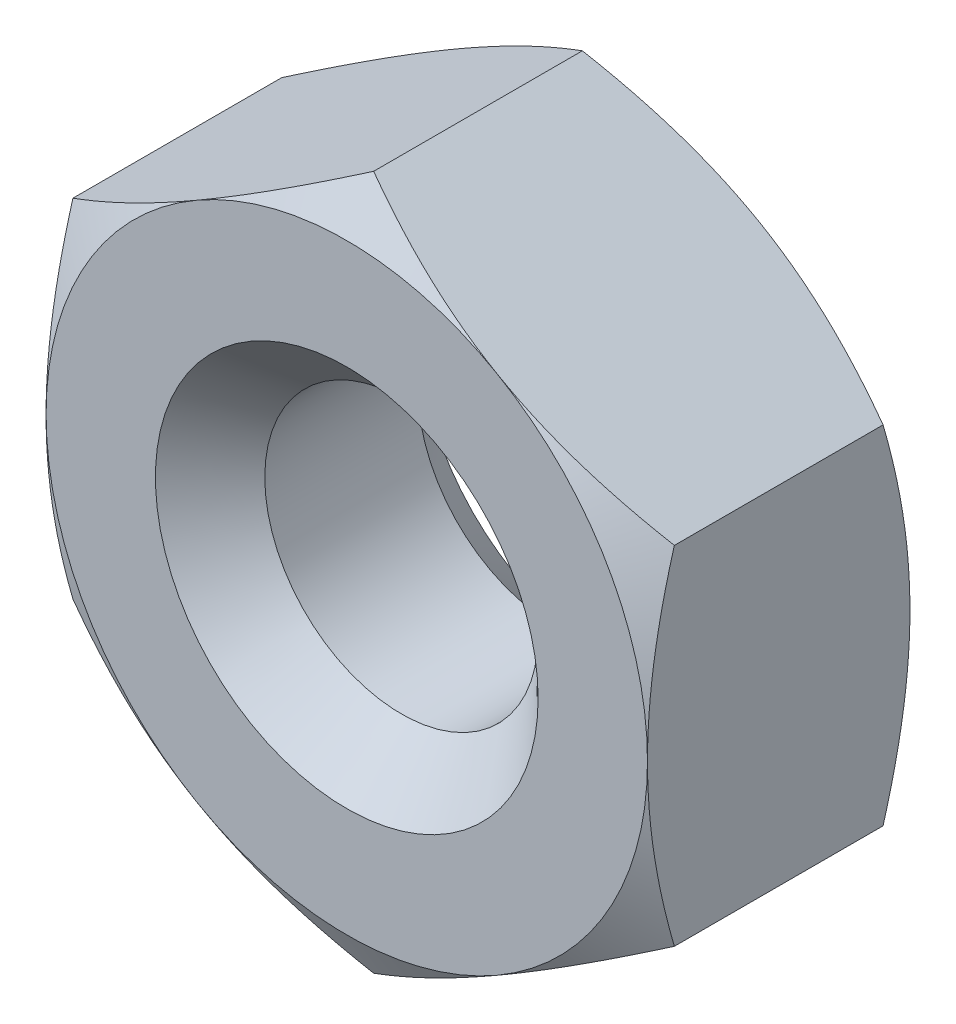
ISO-10303-21;
HEADER;
FILE_DESCRIPTION(('STEP AP214'),'2;1');
FILE_NAME('part.step','',(''),(''),'','','');
FILE_SCHEMA(('AUTOMOTIVE_DESIGN { 1 0 10303 214 1 1 1 1 }'));
ENDSEC;
DATA;
#1=APPLICATION_CONTEXT('core data for automotive mechanical design processes');
#2=APPLICATION_PROTOCOL_DEFINITION('international standard','automotive_design',2000,#1);
#3=PRODUCT_CONTEXT('',#1,'mechanical');
#4=PRODUCT('Part','Part','',(#3));
#5=PRODUCT_RELATED_PRODUCT_CATEGORY('part','',(#4));
#6=PRODUCT_DEFINITION_FORMATION('','',#4);
#7=PRODUCT_DEFINITION_CONTEXT('part definition',#1,'design');
#8=PRODUCT_DEFINITION('design','',#6,#7);
#9=PRODUCT_DEFINITION_SHAPE('','',#8);
#10=(LENGTH_UNIT() NAMED_UNIT(*) SI_UNIT(.MILLI.,.METRE.));
#11=(NAMED_UNIT(*) PLANE_ANGLE_UNIT() SI_UNIT($,.RADIAN.));
#12=(NAMED_UNIT(*) SI_UNIT($,.STERADIAN.) SOLID_ANGLE_UNIT());
#13=UNCERTAINTY_MEASURE_WITH_UNIT(LENGTH_MEASURE(1.E-05),#10,'distance_accuracy_value','');
#14=(GEOMETRIC_REPRESENTATION_CONTEXT(3) GLOBAL_UNCERTAINTY_ASSIGNED_CONTEXT((#13)) GLOBAL_UNIT_ASSIGNED_CONTEXT((#10,
#11,#12)) REPRESENTATION_CONTEXT('',''));
#15=CARTESIAN_POINT('',(0.,0.,0.));
#16=DIRECTION('',(0.,0.,1.));
#17=DIRECTION('',(1.,0.,0.));
#18=AXIS2_PLACEMENT_3D('',#15,#16,#17);
#19=CARTESIAN_POINT('',(0.,0.,2.4));
#20=DIRECTION('',(0.,0.,1.));
#21=DIRECTION('',(1.,0.,0.));
#22=AXIS2_PLACEMENT_3D('',#19,#20,#21);
#23=PLANE('',#22);
#24=CARTESIAN_POINT('',(0.,0.,2.4));
#25=DIRECTION('',(0.,0.,1.));
#26=DIRECTION('',(1.,0.,0.));
#27=AXIS2_PLACEMENT_3D('',#24,#25,#26);
#28=CIRCLE('',#27,1.75);
#29=CARTESIAN_POINT('',(1.75,0.,2.4));
#30=VERTEX_POINT('',#29);
#31=EDGE_CURVE('E288',#30,#30,#28,.F.);
#32=ORIENTED_EDGE('',*,*,#31,.T.);
#33=EDGE_LOOP('',(#32));
#34=FACE_BOUND('',#33,.T.);
#35=CARTESIAN_POINT('',(0.,0.,2.4));
#36=DIRECTION('',(0.,0.,1.));
#37=DIRECTION('',(1.,0.,0.));
#38=AXIS2_PLACEMENT_3D('',#35,#36,#37);
#39=CIRCLE('',#38,2.75);
#40=CARTESIAN_POINT('',(2.75,0.,2.4));
#41=VERTEX_POINT('',#40);
#42=CARTESIAN_POINT('',(1.375,-2.38156986040721,2.4));
#43=VERTEX_POINT('',#42);
#44=EDGE_CURVE('E11',#41,#43,#39,.F.);
#45=ORIENTED_EDGE('',*,*,#44,.F.);
#46=CARTESIAN_POINT('',(1.375,2.38156986040721,2.4));
#47=VERTEX_POINT('',#46);
#48=EDGE_CURVE('E45',#47,#41,#39,.F.);
#49=ORIENTED_EDGE('',*,*,#48,.F.);
#50=CARTESIAN_POINT('',(-1.375,2.38156986040721,2.4));
#51=VERTEX_POINT('',#50);
#52=EDGE_CURVE('E296',#51,#47,#39,.F.);
#53=ORIENTED_EDGE('',*,*,#52,.F.);
#54=CARTESIAN_POINT('',(0.,0.,2.4));
#55=DIRECTION('',(0.,0.,-1.));
#56=DIRECTION('',(-1.,0.,0.));
#57=AXIS2_PLACEMENT_3D('',#54,#55,#56);
#58=CIRCLE('',#57,2.75);
#59=CARTESIAN_POINT('',(-2.75,0.,2.4));
#60=VERTEX_POINT('',#59);
#61=EDGE_CURVE('E156',#60,#51,#58,.T.);
#62=ORIENTED_EDGE('',*,*,#61,.F.);
#63=CARTESIAN_POINT('',(-1.375,-2.38156986040721,2.4));
#64=VERTEX_POINT('',#63);
#65=EDGE_CURVE('E301',#64,#60,#39,.F.);
#66=ORIENTED_EDGE('',*,*,#65,.F.);
#67=EDGE_CURVE('E50',#43,#64,#39,.F.);
#68=ORIENTED_EDGE('',*,*,#67,.F.);
#69=EDGE_LOOP('',(#45,#49,#53,#62,#66,#68));
#70=FACE_BOUND('',#69,.T.);
#71=ADVANCED_FACE('F40',(#34,#70),#23,.T.);
#72=CARTESIAN_POINT('',(0.,0.,0.));
#73=DIRECTION('',(0.,0.,1.));
#74=DIRECTION('',(1.,0.,0.));
#75=AXIS2_PLACEMENT_3D('',#72,#73,#74);
#76=PLANE('',#75);
#77=CARTESIAN_POINT('',(0.,0.,0.));
#78=DIRECTION('',(0.,0.,1.));
#79=DIRECTION('',(1.,0.,0.));
#80=AXIS2_PLACEMENT_3D('',#77,#78,#79);
#81=CIRCLE('',#80,1.75);
#82=CARTESIAN_POINT('',(1.75,0.,0.));
#83=VERTEX_POINT('',#82);
#84=EDGE_CURVE('E279',#83,#83,#81,.T.);
#85=ORIENTED_EDGE('',*,*,#84,.T.);
#86=EDGE_LOOP('',(#85));
#87=FACE_BOUND('',#86,.T.);
#88=CARTESIAN_POINT('',(0.,0.,0.));
#89=DIRECTION('',(0.,0.,1.));
#90=DIRECTION('',(1.,0.,0.));
#91=AXIS2_PLACEMENT_3D('',#88,#89,#90);
#92=CIRCLE('',#91,2.75);
#93=CARTESIAN_POINT('',(1.375,2.38156986040721,0.));
#94=VERTEX_POINT('',#93);
#95=CARTESIAN_POINT('',(2.75,0.,0.));
#96=VERTEX_POINT('',#95);
#97=EDGE_CURVE('E290',#94,#96,#92,.F.);
#98=ORIENTED_EDGE('',*,*,#97,.T.);
#99=CARTESIAN_POINT('',(1.375,-2.38156986040721,0.));
#100=VERTEX_POINT('',#99);
#101=EDGE_CURVE('E291',#96,#100,#92,.F.);
#102=ORIENTED_EDGE('',*,*,#101,.T.);
#103=CARTESIAN_POINT('',(-1.375,-2.38156986040721,0.));
#104=VERTEX_POINT('',#103);
#105=EDGE_CURVE('E162',#100,#104,#92,.F.);
#106=ORIENTED_EDGE('',*,*,#105,.T.);
#107=CARTESIAN_POINT('',(-2.75,0.,0.));
#108=VERTEX_POINT('',#107);
#109=EDGE_CURVE('E135',#104,#108,#92,.F.);
#110=ORIENTED_EDGE('',*,*,#109,.T.);
#111=CARTESIAN_POINT('',(0.,0.,0.));
#112=DIRECTION('',(0.,0.,-1.));
#113=DIRECTION('',(-1.,0.,0.));
#114=AXIS2_PLACEMENT_3D('',#111,#112,#113);
#115=CIRCLE('',#114,2.75);
#116=CARTESIAN_POINT('',(-1.375,2.38156986040721,0.));
#117=VERTEX_POINT('',#116);
#118=EDGE_CURVE('E147',#108,#117,#115,.T.);
#119=ORIENTED_EDGE('',*,*,#118,.T.);
#120=EDGE_CURVE('E163',#117,#94,#92,.F.);
#121=ORIENTED_EDGE('',*,*,#120,.T.);
#122=EDGE_LOOP('',(#98,#102,#106,#110,#119,#121));
#123=FACE_BOUND('',#122,.T.);
#124=ADVANCED_FACE('F159',(#87,#123),#76,.F.);
#125=CARTESIAN_POINT('',(0.,0.,2.4));
#126=DIRECTION('',(0.,0.,1.));
#127=DIRECTION('',(1.,0.,0.));
#128=AXIS2_PLACEMENT_3D('',#125,#126,#127);
#129=CYLINDRICAL_SURFACE('',#128,1.25);
#130=CARTESIAN_POINT('',(0.,0.,0.500000000000002));
#131=DIRECTION('',(0.,0.,1.));
#132=DIRECTION('',(1.,0.,0.));
#133=AXIS2_PLACEMENT_3D('',#130,#131,#132);
#134=CIRCLE('',#133,1.25);
#135=CARTESIAN_POINT('',(1.25,0.,0.500000000000002));
#136=VERTEX_POINT('',#135);
#137=EDGE_CURVE('E285',#136,#136,#134,.F.);
#138=ORIENTED_EDGE('',*,*,#137,.T.);
#139=EDGE_LOOP('',(#138));
#140=FACE_BOUND('',#139,.T.);
#141=CARTESIAN_POINT('',(0.,0.,1.9));
#142=DIRECTION('',(0.,0.,1.));
#143=DIRECTION('',(1.,0.,0.));
#144=AXIS2_PLACEMENT_3D('',#141,#142,#143);
#145=CIRCLE('',#144,1.25);
#146=CARTESIAN_POINT('',(1.25,0.,1.9));
#147=VERTEX_POINT('',#146);
#148=EDGE_CURVE('E282',#147,#147,#145,.T.);
#149=ORIENTED_EDGE('',*,*,#148,.T.);
#150=EDGE_LOOP('',(#149));
#151=FACE_BOUND('',#150,.T.);
#152=ADVANCED_FACE('F370',(#140,#151),#129,.F.);
#153=CARTESIAN_POINT('',(0.,0.,0.));
#154=DIRECTION('',(0.,0.,-1.));
#155=DIRECTION('',(-1.,0.,0.));
#156=AXIS2_PLACEMENT_3D('',#153,#154,#155);
#157=CONICAL_SURFACE('',#156,1.75,0.785398163397447);
#158=ORIENTED_EDGE('',*,*,#137,.F.);
#159=EDGE_LOOP('',(#158));
#160=FACE_BOUND('',#159,.T.);
#161=ORIENTED_EDGE('',*,*,#84,.F.);
#162=EDGE_LOOP('',(#161));
#163=FACE_BOUND('',#162,.T.);
#164=ADVANCED_FACE('F373',(#160,#163),#157,.F.);
#165=CARTESIAN_POINT('',(0.,0.,1.9));
#166=DIRECTION('',(0.,0.,1.));
#167=DIRECTION('',(1.,0.,0.));
#168=AXIS2_PLACEMENT_3D('',#165,#166,#167);
#169=CONICAL_SURFACE('',#168,1.25,0.785398163397451);
#170=ORIENTED_EDGE('',*,*,#31,.F.);
#171=EDGE_LOOP('',(#170));
#172=FACE_BOUND('',#171,.T.);
#173=ORIENTED_EDGE('',*,*,#148,.F.);
#174=EDGE_LOOP('',(#173));
#175=FACE_BOUND('',#174,.T.);
#176=ADVANCED_FACE('F43',(#172,#175),#169,.F.);
#177=CARTESIAN_POINT('',(0.,0.,0.721687836487023));
#178=DIRECTION('',(0.,0.,1.));
#179=DIRECTION('',(1.,0.,0.));
#180=AXIS2_PLACEMENT_3D('',#177,#178,#179);
#181=CONICAL_SURFACE('',#180,4.,1.0471975511966);
#182=ORIENTED_EDGE('',*,*,#97,.F.);
#183=CARTESIAN_POINT('',(2.7502,1.58759777021763,0.245686763364757));
#184=CARTESIAN_POINT('',(2.62935077934009,1.65737010029699,0.205387662249261));
#185=CARTESIAN_POINT('',(2.50745839737737,1.72774469983533,0.16873690259766));
#186=CARTESIAN_POINT('',(2.26156287327211,1.86971254687003,0.1047621829698));
#187=CARTESIAN_POINT('',(2.13755536142615,1.94130831721583,0.0774608556744965));
#188=CARTESIAN_POINT('',(1.89107720202406,2.08361254889599,0.0349617452941165));
#189=CARTESIAN_POINT('',(1.76864448141258,2.15429911309864,0.0194811186224576));
#190=CARTESIAN_POINT('',(1.52320285763109,2.29600490065923,0.000999397369940418));
#191=CARTESIAN_POINT('',(1.40019484676709,2.36702360884404,-0.0020170005374003));
#192=CARTESIAN_POINT('',(1.17034121338921,2.49972966594897,0.00425314542854662));
#193=CARTESIAN_POINT('',(1.06346120874598,2.56143686540073,0.0120001542767022));
#194=CARTESIAN_POINT('',(0.850397532665251,2.68444923614047,0.0365551810643545));
#195=CARTESIAN_POINT('',(0.744214598351112,2.74575398185008,0.0533715896505699));
#196=CARTESIAN_POINT('',(0.530711510606817,2.86902004703206,0.0954119223459554));
#197=CARTESIAN_POINT('',(0.423418383857145,2.93096576264318,0.12081408068723));
#198=CARTESIAN_POINT('',(0.210432520715949,3.05393320806134,0.17846722583998));
#199=CARTESIAN_POINT('',(0.104737054973348,3.11495651365995,0.21070466329898));
#200=CARTESIAN_POINT('',(-0.000199999999999574,3.17554195059678,0.245686763364758));
#201=B_SPLINE_CURVE_WITH_KNOTS('',3,(#183,#184,#185,#186,#187,#188,#189,#190,#191,#192,#193,
#194,#195,#196,#197,#198,#199,#200),.UNSPECIFIED.,.F.,.F.,(4,2,2,2,2,2,2,2,4),(0.,
0.435912828725888,0.872873557116331,1.29901931904671,1.72464171213573,2.09526089052937,
2.46622354066374,2.84541551798557,3.22386274754524),.UNSPECIFIED.);
#202=CARTESIAN_POINT('',(2.75,1.58771324027147,0.245620093061859));
#203=VERTEX_POINT('',#202);
#204=EDGE_CURVE('E222',#203,#94,#201,.T.);
#205=ORIENTED_EDGE('',*,*,#204,.F.);
#206=CARTESIAN_POINT('',(2.75,-4.84431718736812,1.6283873495645));
#207=CARTESIAN_POINT('',(2.75,-4.72881087619165,1.57040166183578));
#208=CARTESIAN_POINT('',(2.75,-4.613107122414,1.51280523870521));
#209=CARTESIAN_POINT('',(2.75,-4.38121818949172,1.39858156337326));
#210=CARTESIAN_POINT('',(2.75,-4.26503299589271,1.34195434053612));
#211=CARTESIAN_POINT('',(2.75,-4.03187275444277,1.22975310374984));
#212=CARTESIAN_POINT('',(2.75,-3.91489660311583,1.17418137811978));
#213=CARTESIAN_POINT('',(2.75,-3.68027292420423,1.06446639733525));
#214=CARTESIAN_POINT('',(2.75,-3.56262538653173,1.0103231637135));
#215=CARTESIAN_POINT('',(2.75,-3.32110568707279,0.90134977976564));
#216=CARTESIAN_POINT('',(2.75,-3.19719601705447,0.846602488403247));
#217=CARTESIAN_POINT('',(2.75,-2.94833281757459,0.739536762937581));
#218=CARTESIAN_POINT('',(2.75,-2.82337932375583,0.687218246297218));
#219=CARTESIAN_POINT('',(2.75,-2.57231227099915,0.585706570332173));
#220=CARTESIAN_POINT('',(2.75,-2.44619966967532,0.5365110574035));
#221=CARTESIAN_POINT('',(2.75,-2.19245965751597,0.442062957732809));
#222=CARTESIAN_POINT('',(2.75,-2.06483184184046,0.396811452987174));
#223=CARTESIAN_POINT('',(2.75,-1.77885837982119,0.301751525463948));
#224=CARTESIAN_POINT('',(2.75,-1.62008075415121,0.253219510905382));
#225=CARTESIAN_POINT('',(2.75,-1.29975758474136,0.166510744821865));
#226=CARTESIAN_POINT('',(2.75,-1.13821370405206,0.128327988761268));
#227=CARTESIAN_POINT('',(2.75,-0.815215963199132,0.0660070585770691));
#228=CARTESIAN_POINT('',(2.75,-0.653807594650374,0.0416403707600667));
#229=CARTESIAN_POINT('',(2.75,-0.329396325751915,0.00869868427947316));
#230=CARTESIAN_POINT('',(2.75,-0.166394179200517,0.000116551902944405));
#231=CARTESIAN_POINT('',(2.75,0.160739984828656,-0.000114935870290922));
#232=CARTESIAN_POINT('',(2.75,0.324872098236976,0.00835202698533779));
#233=CARTESIAN_POINT('',(2.75,0.651530753809058,0.0412983620798574));
#234=CARTESIAN_POINT('',(2.75,0.814056514068522,0.0657851766580929));
#235=CARTESIAN_POINT('',(2.75,1.13928393014411,0.128532619195259));
#236=CARTESIAN_POINT('',(2.75,1.30193924223833,0.167025964238499));
#237=CARTESIAN_POINT('',(2.75,1.62444761734759,0.254478654512365));
#238=CARTESIAN_POINT('',(2.75,1.78429897017774,0.303444162110581));
#239=CARTESIAN_POINT('',(2.75,2.07102641359458,0.398968467684087));
#240=CARTESIAN_POINT('',(2.75,2.19835532641628,0.444192572607103));
#241=CARTESIAN_POINT('',(2.75,2.45150671445433,0.538554303823242));
#242=CARTESIAN_POINT('',(2.75,2.57732960100873,0.587690832107361));
#243=CARTESIAN_POINT('',(2.75,2.82782299822562,0.689060979100315));
#244=CARTESIAN_POINT('',(2.75,2.95249257862101,0.741296882184451));
#245=CARTESIAN_POINT('',(2.75,3.20079440467455,0.848180997931798));
#246=CARTESIAN_POINT('',(2.75,3.3244266154046,0.902829291435118));
#247=CARTESIAN_POINT('',(2.75,3.56540835603176,1.01159734167761));
#248=CARTESIAN_POINT('',(2.75,3.68279517703379,1.06563474604806));
#249=CARTESIAN_POINT('',(2.75,3.91690099199632,1.17512998929804));
#250=CARTESIAN_POINT('',(2.75,4.03361999642037,1.23058780584715));
#251=CARTESIAN_POINT('',(2.75,4.2662734571595,1.34255745971332));
#252=CARTESIAN_POINT('',(2.75,4.38220899134617,1.39906706203021));
#253=CARTESIAN_POINT('',(2.75,4.61360094528584,1.51305102022748));
#254=CARTESIAN_POINT('',(2.75,4.72905737892984,1.57052534788947));
#255=CARTESIAN_POINT('',(2.75,4.84431718736812,1.6283873495645));
#256=B_SPLINE_CURVE_WITH_KNOTS('',3,(#206,#207,#208,#209,#210,#211,#212,#213,#214,#215,#216,
#217,#218,#219,#220,#221,#222,#223,#224,#225,#226,#227,#228,#229,#230,#231,#232,#233,#234,#235,
#236,#237,#238,#239,#240,#241,#242,#243,#244,#245,#246,#247,#248,#249,#250,#251,#252,#253,#254,
#255),.UNSPECIFIED.,.F.,.F.,(4,2,2,2,2,2,2,2,2,2,2,2,2,2,2,2,2,2,2,2,2,2,2,2,4),(0.,
0.387734384515874,0.775480495647767,1.16398856227904,1.55250248183454,1.95887809096812,
2.3652398801083,2.77129169331545,3.1774545541382,3.67528250616232,4.17282100212455,
4.66187047717732,5.15069887557993,5.6428736279506,6.13527719236992,6.63626635149214,
7.1375511339785,7.54284286717502,7.94802125477198,8.3535020784526,8.75899650027815,
9.14666728177633,9.53433197240334,9.92125025426186,10.3081572383489),.UNSPECIFIED.);
#257=EDGE_CURVE('E223',#96,#203,#256,.T.);
#258=ORIENTED_EDGE('',*,*,#257,.F.);
#259=EDGE_LOOP('',(#182,#205,#258));
#260=FACE_BOUND('',#259,.T.);
#261=ADVANCED_FACE('F199',(#260),#181,.T.);
#262=ORIENTED_EDGE('',*,*,#120,.F.);
#263=CARTESIAN_POINT('',(0.000200000000000906,3.17554195059678,0.245686763364758));
#264=CARTESIAN_POINT('',(-0.120649220659905,3.10576962051743,0.205387662249261));
#265=CARTESIAN_POINT('',(-0.242541602622633,3.03539502097908,0.168736902597661));
#266=CARTESIAN_POINT('',(-0.488437126727891,2.89342717394439,0.1047621829698));
#267=CARTESIAN_POINT('',(-0.612444638573854,2.82183140359858,0.0774608556744967));
#268=CARTESIAN_POINT('',(-0.858922797975942,2.67952717191843,0.0349617452941167));
#269=CARTESIAN_POINT('',(-0.981355518587416,2.60884060771577,0.0194811186224579));
#270=CARTESIAN_POINT('',(-1.22679714236891,2.46713482015519,0.000999397369940775));
#271=CARTESIAN_POINT('',(-1.34980515323291,2.39611611197038,-0.00201700053739995));
#272=CARTESIAN_POINT('',(-1.57965878661079,2.26341005486544,0.00425314542854686));
#273=CARTESIAN_POINT('',(-1.68653879125402,2.20170285541369,0.0120001542767024));
#274=CARTESIAN_POINT('',(-1.89960246733475,2.07869048467395,0.0365551810643544));
#275=CARTESIAN_POINT('',(-2.00578540164889,2.01738573896434,0.0533715896505697));
#276=CARTESIAN_POINT('',(-2.21928848939318,1.89411967378235,0.0954119223459552));
#277=CARTESIAN_POINT('',(-2.32658161614285,1.83217395817123,0.120814080687229));
#278=CARTESIAN_POINT('',(-2.53956747928405,1.70920651275308,0.17846722583998));
#279=CARTESIAN_POINT('',(-2.64526294502665,1.64818320715446,0.21070466329898));
#280=CARTESIAN_POINT('',(-2.7502,1.58759777021763,0.245686763364758));
#281=B_SPLINE_CURVE_WITH_KNOTS('',3,(#263,#264,#265,#266,#267,#268,#269,#270,#271,#272,#273,
#274,#275,#276,#277,#278,#279,#280),.UNSPECIFIED.,.F.,.F.,(4,2,2,2,2,2,2,2,4),(0.,
0.435912828725888,0.872873557116331,1.29901931904671,1.72464171213573,2.09526089052937,
2.46622354066374,2.84541551798557,3.22386274754524),.UNSPECIFIED.);
#282=CARTESIAN_POINT('',(0.,3.17542648054294,0.24562009306186));
#283=VERTEX_POINT('',#282);
#284=EDGE_CURVE('E169',#283,#117,#281,.T.);
#285=ORIENTED_EDGE('',*,*,#284,.F.);
#286=EDGE_CURVE('E215',#94,#283,#201,.T.);
#287=ORIENTED_EDGE('',*,*,#286,.F.);
#288=EDGE_LOOP('',(#262,#285,#287));
#289=FACE_BOUND('',#288,.T.);
#290=ADVANCED_FACE('F343',(#289),#181,.T.);
#291=ORIENTED_EDGE('',*,*,#118,.F.);
#292=CARTESIAN_POINT('',(-2.75,4.84431718736813,1.6283873495645));
#293=CARTESIAN_POINT('',(-2.75,4.72881087619165,1.57040166183578));
#294=CARTESIAN_POINT('',(-2.75,4.613107122414,1.51280523870521));
#295=CARTESIAN_POINT('',(-2.75,4.38121818949172,1.39858156337326));
#296=CARTESIAN_POINT('',(-2.75,4.26503299589272,1.34195434053612));
#297=CARTESIAN_POINT('',(-2.75,4.03187275444277,1.22975310374984));
#298=CARTESIAN_POINT('',(-2.75,3.91489660311583,1.17418137811978));
#299=CARTESIAN_POINT('',(-2.75,3.68027292420423,1.06446639733526));
#300=CARTESIAN_POINT('',(-2.75,3.56262538653174,1.0103231637135));
#301=CARTESIAN_POINT('',(-2.75,3.32110568707279,0.901349779765643));
#302=CARTESIAN_POINT('',(-2.75,3.19719601705447,0.846602488403249));
#303=CARTESIAN_POINT('',(-2.75,2.94833281757459,0.739536762937583));
#304=CARTESIAN_POINT('',(-2.75,2.82337932375583,0.687218246297219));
#305=CARTESIAN_POINT('',(-2.75,2.57231227099915,0.585706570332174));
#306=CARTESIAN_POINT('',(-2.75,2.44619966967532,0.536511057403501));
#307=CARTESIAN_POINT('',(-2.75,2.19245965751597,0.44206295773281));
#308=CARTESIAN_POINT('',(-2.75,2.06483184184046,0.396811452987175));
#309=CARTESIAN_POINT('',(-2.75,1.77885837982119,0.301751525463949));
#310=CARTESIAN_POINT('',(-2.75,1.62008075415122,0.253219510905383));
#311=CARTESIAN_POINT('',(-2.75,1.29975758474137,0.166510744821866));
#312=CARTESIAN_POINT('',(-2.75,1.13821370405206,0.128327988761269));
#313=CARTESIAN_POINT('',(-2.75,0.815215963199135,0.0660070585770696));
#314=CARTESIAN_POINT('',(-2.75,0.653807594650376,0.041640370760067));
#315=CARTESIAN_POINT('',(-2.75,0.329396325751917,0.00869868427947334));
#316=CARTESIAN_POINT('',(-2.75,0.166394179200519,0.000116551902944489));
#317=CARTESIAN_POINT('',(-2.75,-0.160739984828655,-0.00011493587029104));
#318=CARTESIAN_POINT('',(-2.75,-0.324872098236975,0.00835202698533756));
#319=CARTESIAN_POINT('',(-2.75,-0.651530753809057,0.0412983620798571));
#320=CARTESIAN_POINT('',(-2.75,-0.814056514068521,0.0657851766580925));
#321=CARTESIAN_POINT('',(-2.75,-1.13928393014411,0.128532619195259));
#322=CARTESIAN_POINT('',(-2.75,-1.30193924223833,0.167025964238499));
#323=CARTESIAN_POINT('',(-2.75,-1.62444761734759,0.254478654512365));
#324=CARTESIAN_POINT('',(-2.75,-1.78429897017774,0.30344416211058));
#325=CARTESIAN_POINT('',(-2.75,-2.07102641359458,0.398968467684087));
#326=CARTESIAN_POINT('',(-2.75,-2.19835532641628,0.444192572607103));
#327=CARTESIAN_POINT('',(-2.75,-2.45150671445433,0.538554303823242));
#328=CARTESIAN_POINT('',(-2.75,-2.57732960100873,0.587690832107362));
#329=CARTESIAN_POINT('',(-2.75,-2.82782299822562,0.689060979100315));
#330=CARTESIAN_POINT('',(-2.75,-2.95249257862101,0.741296882184451));
#331=CARTESIAN_POINT('',(-2.75,-3.20079440467455,0.848180997931798));
#332=CARTESIAN_POINT('',(-2.75,-3.3244266154046,0.902829291435118));
#333=CARTESIAN_POINT('',(-2.75,-3.56540835603176,1.01159734167761));
#334=CARTESIAN_POINT('',(-2.75,-3.68279517703379,1.06563474604806));
#335=CARTESIAN_POINT('',(-2.75,-3.91690099199632,1.17512998929804));
#336=CARTESIAN_POINT('',(-2.75,-4.03361999642037,1.23058780584715));
#337=CARTESIAN_POINT('',(-2.75,-4.26627345715951,1.34255745971332));
#338=CARTESIAN_POINT('',(-2.75,-4.38220899134617,1.39906706203021));
#339=CARTESIAN_POINT('',(-2.75,-4.61360094528584,1.51305102022748));
#340=CARTESIAN_POINT('',(-2.75,-4.72905737892984,1.57052534788947));
#341=CARTESIAN_POINT('',(-2.75,-4.84431718736813,1.6283873495645));
#342=B_SPLINE_CURVE_WITH_KNOTS('',3,(#292,#293,#294,#295,#296,#297,#298,#299,#300,#301,#302,
#303,#304,#305,#306,#307,#308,#309,#310,#311,#312,#313,#314,#315,#316,#317,#318,#319,#320,#321,
#322,#323,#324,#325,#326,#327,#328,#329,#330,#331,#332,#333,#334,#335,#336,#337,#338,#339,#340,
#341),.UNSPECIFIED.,.F.,.F.,(4,2,2,2,2,2,2,2,2,2,2,2,2,2,2,2,2,2,2,2,2,2,2,2,4),(0.,
0.387734384515874,0.775480495647767,1.16398856227904,1.55250248183454,1.95887809096812,
2.3652398801083,2.77129169331545,3.1774545541382,3.67528250616232,4.17282100212456,
4.66187047717732,5.15069887557994,5.6428736279506,6.13527719236992,6.63626635149214,
7.1375511339785,7.54284286717502,7.94802125477198,8.35350207845261,8.75899650027815,
9.14666728177634,9.53433197240335,9.92125025426186,10.3081572383489),.UNSPECIFIED.);
#343=CARTESIAN_POINT('',(-2.75,1.58771324027172,0.245620093061717));
#344=VERTEX_POINT('',#343);
#345=EDGE_CURVE('E143',#344,#108,#342,.T.);
#346=ORIENTED_EDGE('',*,*,#345,.F.);
#347=EDGE_CURVE('E150',#117,#344,#281,.T.);
#348=ORIENTED_EDGE('',*,*,#347,.F.);
#349=EDGE_LOOP('',(#291,#346,#348));
#350=FACE_BOUND('',#349,.T.);
#351=ADVANCED_FACE('F148',(#350),#181,.T.);
#352=ORIENTED_EDGE('',*,*,#109,.F.);
#353=CARTESIAN_POINT('',(-2.7502,-1.58759777021763,0.245686763364758));
#354=CARTESIAN_POINT('',(-2.62935077934009,-1.65737010029699,0.205387662249261));
#355=CARTESIAN_POINT('',(-2.50745839737737,-1.72774469983533,0.168736902597661));
#356=CARTESIAN_POINT('',(-2.26156287327211,-1.86971254687003,0.1047621829698));
#357=CARTESIAN_POINT('',(-2.13755536142614,-1.94130831721583,0.0774608556744966));
#358=CARTESIAN_POINT('',(-1.89107720202406,-2.08361254889599,0.0349617452941166));
#359=CARTESIAN_POINT('',(-1.76864448141258,-2.15429911309864,0.0194811186224579));
#360=CARTESIAN_POINT('',(-1.52320285763109,-2.29600490065923,0.000999397369940802));
#361=CARTESIAN_POINT('',(-1.40019484676709,-2.36702360884404,-0.00201700053739999));
#362=CARTESIAN_POINT('',(-1.17034121338921,-2.49972966594897,0.00425314542854671));
#363=CARTESIAN_POINT('',(-1.06346120874598,-2.56143686540073,0.0120001542767022));
#364=CARTESIAN_POINT('',(-0.850397532665251,-2.68444923614047,0.0365551810643543));
#365=CARTESIAN_POINT('',(-0.744214598351111,-2.74575398185008,0.0533715896505697));
#366=CARTESIAN_POINT('',(-0.530711510606816,-2.86902004703206,0.0954119223459554));
#367=CARTESIAN_POINT('',(-0.423418383857145,-2.93096576264318,0.120814080687229));
#368=CARTESIAN_POINT('',(-0.210432520715948,-3.05393320806134,0.17846722583998));
#369=CARTESIAN_POINT('',(-0.104737054973347,-3.11495651365995,0.21070466329898));
#370=CARTESIAN_POINT('',(0.000200000000001011,-3.17554195059678,0.245686763364758));
#371=B_SPLINE_CURVE_WITH_KNOTS('',3,(#353,#354,#355,#356,#357,#358,#359,#360,#361,#362,#363,
#364,#365,#366,#367,#368,#369,#370),.UNSPECIFIED.,.F.,.F.,(4,2,2,2,2,2,2,2,4),(0.,
0.435912828725887,0.872873557116331,1.29901931904671,1.72464171213573,2.09526089052937,
2.46622354066374,2.84541551798557,3.22386274754524),.UNSPECIFIED.);
#372=CARTESIAN_POINT('',(-2.75,-1.58771324027147,0.24562009306186));
#373=VERTEX_POINT('',#372);
#374=EDGE_CURVE('E138',#373,#104,#371,.T.);
#375=ORIENTED_EDGE('',*,*,#374,.F.);
#376=EDGE_CURVE('E131',#108,#373,#342,.T.);
#377=ORIENTED_EDGE('',*,*,#376,.F.);
#378=EDGE_LOOP('',(#352,#375,#377));
#379=FACE_BOUND('',#378,.T.);
#380=ADVANCED_FACE('F133',(#379),#181,.T.);
#381=ORIENTED_EDGE('',*,*,#105,.F.);
#382=CARTESIAN_POINT('',(-0.000199999999999186,-3.17554195059678,0.245686763364758));
#383=CARTESIAN_POINT('',(0.120649220659907,-3.10576962051743,0.205387662249261));
#384=CARTESIAN_POINT('',(0.242541602622634,-3.03539502097908,0.168736902597661));
#385=CARTESIAN_POINT('',(0.488437126727893,-2.89342717394439,0.1047621829698));
#386=CARTESIAN_POINT('',(0.612444638573856,-2.82183140359858,0.0774608556744967));
#387=CARTESIAN_POINT('',(0.858922797975944,-2.67952717191843,0.0349617452941166));
#388=CARTESIAN_POINT('',(0.981355518587418,-2.60884060771577,0.0194811186224578));
#389=CARTESIAN_POINT('',(1.22679714236892,-2.46713482015519,0.000999397369940809));
#390=CARTESIAN_POINT('',(1.34980515323291,-2.39611611197038,-0.00201700053739992));
#391=CARTESIAN_POINT('',(1.57965878661079,-2.26341005486544,0.00425314542854695));
#392=CARTESIAN_POINT('',(1.68653879125402,-2.20170285541369,0.0120001542767025));
#393=CARTESIAN_POINT('',(1.89960246733475,-2.07869048467395,0.0365551810643545));
#394=CARTESIAN_POINT('',(2.00578540164889,-2.01738573896433,0.0533715896505698));
#395=CARTESIAN_POINT('',(2.21928848939318,-1.89411967378235,0.0954119223459552));
#396=CARTESIAN_POINT('',(2.32658161614285,-1.83217395817123,0.120814080687229));
#397=CARTESIAN_POINT('',(2.53956747928405,-1.70920651275308,0.17846722583998));
#398=CARTESIAN_POINT('',(2.64526294502665,-1.64818320715446,0.21070466329898));
#399=CARTESIAN_POINT('',(2.7502,-1.58759777021763,0.245686763364758));
#400=B_SPLINE_CURVE_WITH_KNOTS('',3,(#382,#383,#384,#385,#386,#387,#388,#389,#390,#391,#392,
#393,#394,#395,#396,#397,#398,#399),.UNSPECIFIED.,.F.,.F.,(4,2,2,2,2,2,2,2,4),(0.,
0.435912828725888,0.872873557116331,1.29901931904671,1.72464171213573,2.09526089052937,
2.46622354066374,2.84541551798557,3.22386274754524),.UNSPECIFIED.);
#401=CARTESIAN_POINT('',(0.,-3.17542648054294,0.24562009306186));
#402=VERTEX_POINT('',#401);
#403=EDGE_CURVE('E404',#402,#100,#400,.T.);
#404=ORIENTED_EDGE('',*,*,#403,.F.);
#405=EDGE_CURVE('E178',#104,#402,#371,.T.);
#406=ORIENTED_EDGE('',*,*,#405,.F.);
#407=EDGE_LOOP('',(#381,#404,#406));
#408=FACE_BOUND('',#407,.T.);
#409=ADVANCED_FACE('F197',(#408),#181,.T.);
#410=CARTESIAN_POINT('',(2.75,-1.58771324027147,0.245620093061859));
#411=VERTEX_POINT('',#410);
#412=EDGE_CURVE('E155',#100,#411,#400,.T.);
#413=ORIENTED_EDGE('',*,*,#412,.F.);
#414=ORIENTED_EDGE('',*,*,#101,.F.);
#415=EDGE_CURVE('E346',#411,#96,#256,.T.);
#416=ORIENTED_EDGE('',*,*,#415,.F.);
#417=EDGE_LOOP('',(#413,#414,#416));
#418=FACE_BOUND('',#417,.T.);
#419=ADVANCED_FACE('F192',(#418),#181,.T.);
#420=CARTESIAN_POINT('',(0.,0.,2.4));
#421=DIRECTION('',(0.,0.,-1.));
#422=DIRECTION('',(-1.,0.,0.));
#423=AXIS2_PLACEMENT_3D('',#420,#421,#422);
#424=CONICAL_SURFACE('',#423,2.75,1.0471975511966);
#425=ORIENTED_EDGE('',*,*,#48,.T.);
#426=CARTESIAN_POINT('',(2.75,4.84431718736812,0.771612650435502));
#427=CARTESIAN_POINT('',(2.75,4.72881087619165,0.829598338164221));
#428=CARTESIAN_POINT('',(2.75,4.613107122414,0.88719476129479));
#429=CARTESIAN_POINT('',(2.75,4.38121818949172,1.00141843662674));
#430=CARTESIAN_POINT('',(2.75,4.26503299589271,1.05804565946388));
#431=CARTESIAN_POINT('',(2.75,4.03187275444277,1.17024689625016));
#432=CARTESIAN_POINT('',(2.75,3.91489660311583,1.22581862188022));
#433=CARTESIAN_POINT('',(2.75,3.68027292420423,1.33553360266474));
#434=CARTESIAN_POINT('',(2.75,3.56262538653174,1.3896768362865));
#435=CARTESIAN_POINT('',(2.75,3.32110568707279,1.49865022023436));
#436=CARTESIAN_POINT('',(2.75,3.19719601705447,1.55339751159675));
#437=CARTESIAN_POINT('',(2.75,2.94833281757459,1.66046323706242));
#438=CARTESIAN_POINT('',(2.75,2.82337932375583,1.71278175370278));
#439=CARTESIAN_POINT('',(2.75,2.57231227099915,1.81429342966783));
#440=CARTESIAN_POINT('',(2.75,2.44619966967532,1.8634889425965));
#441=CARTESIAN_POINT('',(2.75,2.19245965751597,1.95793704226719));
#442=CARTESIAN_POINT('',(2.75,2.06483184184046,2.00318854701282));
#443=CARTESIAN_POINT('',(2.75,1.77885837982119,2.09824847453605));
#444=CARTESIAN_POINT('',(2.75,1.62008075415122,2.14678048909462));
#445=CARTESIAN_POINT('',(2.75,1.29975758474137,2.23348925517813));
#446=CARTESIAN_POINT('',(2.75,1.13821370405206,2.27167201123873));
#447=CARTESIAN_POINT('',(2.75,0.815215963199135,2.33399294142293));
#448=CARTESIAN_POINT('',(2.75,0.653807594650377,2.35835962923993));
#449=CARTESIAN_POINT('',(2.75,0.329396325751918,2.39130131572053));
#450=CARTESIAN_POINT('',(2.75,0.16639417920052,2.39988344809706));
#451=CARTESIAN_POINT('',(2.75,-0.160739984828653,2.40011493587029));
#452=CARTESIAN_POINT('',(2.75,-0.324872098236973,2.39164797301466));
#453=CARTESIAN_POINT('',(2.75,-0.651530753809055,2.35870163792014));
#454=CARTESIAN_POINT('',(2.75,-0.814056514068519,2.33421482334191));
#455=CARTESIAN_POINT('',(2.75,-1.13928393014411,2.27146738080474));
#456=CARTESIAN_POINT('',(2.75,-1.30193924223832,2.2329740357615));
#457=CARTESIAN_POINT('',(2.75,-1.62444761734759,2.14552134548764));
#458=CARTESIAN_POINT('',(2.75,-1.78429897017774,2.09655583788942));
#459=CARTESIAN_POINT('',(2.75,-2.07102641359458,2.00103153231591));
#460=CARTESIAN_POINT('',(2.75,-2.19835532641627,1.9558074273929));
#461=CARTESIAN_POINT('',(2.75,-2.45150671445432,1.86144569617676));
#462=CARTESIAN_POINT('',(2.75,-2.57732960100873,1.81230916789264));
#463=CARTESIAN_POINT('',(2.75,-2.82782299822562,1.71093902089968));
#464=CARTESIAN_POINT('',(2.75,-2.95249257862101,1.65870311781555));
#465=CARTESIAN_POINT('',(2.75,-3.20079440467455,1.5518190020682));
#466=CARTESIAN_POINT('',(2.75,-3.32442661540459,1.49717070856488));
#467=CARTESIAN_POINT('',(2.75,-3.56540835603175,1.38840265832239));
#468=CARTESIAN_POINT('',(2.75,-3.68279517703379,1.33436525395194));
#469=CARTESIAN_POINT('',(2.75,-3.91690099199632,1.22487001070196));
#470=CARTESIAN_POINT('',(2.75,-4.03361999642037,1.16941219415285));
#471=CARTESIAN_POINT('',(2.75,-4.2662734571595,1.05744254028668));
#472=CARTESIAN_POINT('',(2.75,-4.38220899134617,1.00093293796979));
#473=CARTESIAN_POINT('',(2.75,-4.61360094528584,0.886948979772523));
#474=CARTESIAN_POINT('',(2.75,-4.72905737892984,0.829474652110532));
#475=CARTESIAN_POINT('',(2.75,-4.84431718736812,0.771612650435502));
#476=B_SPLINE_CURVE_WITH_KNOTS('',3,(#426,#427,#428,#429,#430,#431,#432,#433,#434,#435,#436,
#437,#438,#439,#440,#441,#442,#443,#444,#445,#446,#447,#448,#449,#450,#451,#452,#453,#454,#455,
#456,#457,#458,#459,#460,#461,#462,#463,#464,#465,#466,#467,#468,#469,#470,#471,#472,#473,#474,
#475),.UNSPECIFIED.,.F.,.F.,(4,2,2,2,2,2,2,2,2,2,2,2,2,2,2,2,2,2,2,2,2,2,2,2,4),(0.,
0.387734384515874,0.775480495647767,1.16398856227904,1.55250248183454,1.95887809096811,
2.36523988010829,2.77129169331544,3.17745455413819,3.67528250616232,4.17282100212455,
4.66187047717732,5.15069887557993,5.6428736279506,6.13527719236991,6.63626635149214,
7.1375511339785,7.54284286717501,7.94802125477198,8.3535020784526,8.75899650027815,
9.14666728177633,9.53433197240334,9.92125025426186,10.3081572383489),.UNSPECIFIED.);
#477=CARTESIAN_POINT('',(2.75,1.58771324027172,2.15437990693828));
#478=VERTEX_POINT('',#477);
#479=EDGE_CURVE('E322',#478,#41,#476,.T.);
#480=ORIENTED_EDGE('',*,*,#479,.F.);
#481=CARTESIAN_POINT('',(-0.000199999999999133,3.17554195059678,2.15431323663524));
#482=CARTESIAN_POINT('',(0.120649220659907,3.10576962051743,2.19461233775074));
#483=CARTESIAN_POINT('',(0.242541602622634,3.03539502097908,2.23126309740234));
#484=CARTESIAN_POINT('',(0.488437126727893,2.89342717394439,2.2952378170302));
#485=CARTESIAN_POINT('',(0.612444638573856,2.82183140359858,2.3225391443255));
#486=CARTESIAN_POINT('',(0.858922797975944,2.67952717191843,2.36503825470588));
#487=CARTESIAN_POINT('',(0.981355518587417,2.60884060771577,2.38051888137754));
#488=CARTESIAN_POINT('',(1.22679714236891,2.46713482015519,2.39900060263006));
#489=CARTESIAN_POINT('',(1.34980515323291,2.39611611197038,2.4020170005374));
#490=CARTESIAN_POINT('',(1.57965878661079,2.26341005486544,2.39574685457145));
#491=CARTESIAN_POINT('',(1.68653879125402,2.20170285541369,2.3879998457233));
#492=CARTESIAN_POINT('',(1.89960246733475,2.07869048467395,2.36344481893565));
#493=CARTESIAN_POINT('',(2.00578540164889,2.01738573896433,2.34662841034943));
#494=CARTESIAN_POINT('',(2.21928848939318,1.89411967378235,2.30458807765404));
#495=CARTESIAN_POINT('',(2.32658161614285,1.83217395817123,2.27918591931277));
#496=CARTESIAN_POINT('',(2.53956747928405,1.70920651275308,2.22153277416002));
#497=CARTESIAN_POINT('',(2.64526294502665,1.64818320715446,2.18929533670102));
#498=CARTESIAN_POINT('',(2.7502,1.58759777021763,2.15431323663524));
#499=B_SPLINE_CURVE_WITH_KNOTS('',3,(#481,#482,#483,#484,#485,#486,#487,#488,#489,#490,#491,
#492,#493,#494,#495,#496,#497,#498),.UNSPECIFIED.,.F.,.F.,(4,2,2,2,2,2,2,2,4),(0.,
0.435912828725888,0.872873557116331,1.29901931904671,1.72464171213573,2.09526089052937,
2.46622354066374,2.84541551798557,3.22386274754524),.UNSPECIFIED.);
#500=EDGE_CURVE('E240',#47,#478,#499,.T.);
#501=ORIENTED_EDGE('',*,*,#500,.F.);
#502=EDGE_LOOP('',(#425,#480,#501));
#503=FACE_BOUND('',#502,.T.);
#504=ADVANCED_FACE('F196',(#503),#424,.T.);
#505=ORIENTED_EDGE('',*,*,#52,.T.);
#506=CARTESIAN_POINT('',(0.,3.17542648054294,2.15437990693814));
#507=VERTEX_POINT('',#506);
#508=EDGE_CURVE('E248',#507,#47,#499,.T.);
#509=ORIENTED_EDGE('',*,*,#508,.F.);
#510=CARTESIAN_POINT('',(-2.7502,1.58759777021763,2.15431323663524));
#511=CARTESIAN_POINT('',(-2.62935077934009,1.65737010029699,2.19461233775074));
#512=CARTESIAN_POINT('',(-2.50745839737737,1.72774469983533,2.23126309740234));
#513=CARTESIAN_POINT('',(-2.26156287327211,1.86971254687003,2.2952378170302));
#514=CARTESIAN_POINT('',(-2.13755536142614,1.94130831721583,2.3225391443255));
#515=CARTESIAN_POINT('',(-1.89107720202406,2.08361254889599,2.36503825470588));
#516=CARTESIAN_POINT('',(-1.76864448141258,2.15429911309864,2.38051888137754));
#517=CARTESIAN_POINT('',(-1.52320285763109,2.29600490065923,2.39900060263006));
#518=CARTESIAN_POINT('',(-1.40019484676709,2.36702360884404,2.4020170005374));
#519=CARTESIAN_POINT('',(-1.17034121338921,2.49972966594897,2.39574685457145));
#520=CARTESIAN_POINT('',(-1.06346120874598,2.56143686540073,2.3879998457233));
#521=CARTESIAN_POINT('',(-0.850397532665251,2.68444923614047,2.36344481893564));
#522=CARTESIAN_POINT('',(-0.744214598351111,2.74575398185008,2.34662841034943));
#523=CARTESIAN_POINT('',(-0.530711510606816,2.86902004703206,2.30458807765404));
#524=CARTESIAN_POINT('',(-0.423418383857145,2.93096576264318,2.27918591931277));
#525=CARTESIAN_POINT('',(-0.210432520715948,3.05393320806134,2.22153277416002));
#526=CARTESIAN_POINT('',(-0.104737054973347,3.11495651365995,2.18929533670102));
#527=CARTESIAN_POINT('',(0.000200000000001263,3.17554195059678,2.15431323663524));
#528=B_SPLINE_CURVE_WITH_KNOTS('',3,(#510,#511,#512,#513,#514,#515,#516,#517,#518,#519,#520,
#521,#522,#523,#524,#525,#526,#527),.UNSPECIFIED.,.F.,.F.,(4,2,2,2,2,2,2,2,4),(0.,
0.435912828725888,0.872873557116331,1.29901931904671,1.72464171213573,2.09526089052937,
2.46622354066374,2.84541551798557,3.22386274754524),.UNSPECIFIED.);
#529=EDGE_CURVE('E255',#51,#507,#528,.T.);
#530=ORIENTED_EDGE('',*,*,#529,.F.);
#531=EDGE_LOOP('',(#505,#509,#530));
#532=FACE_BOUND('',#531,.T.);
#533=ADVANCED_FACE('F416',(#532),#424,.T.);
#534=CARTESIAN_POINT('',(-2.75,-4.84431718736813,0.7716126504355));
#535=CARTESIAN_POINT('',(-2.75,-4.72881087619165,0.829598338164219));
#536=CARTESIAN_POINT('',(-2.75,-4.613107122414,0.887194761294788));
#537=CARTESIAN_POINT('',(-2.75,-4.38121818949172,1.00141843662673));
#538=CARTESIAN_POINT('',(-2.75,-4.26503299589272,1.05804565946388));
#539=CARTESIAN_POINT('',(-2.75,-4.03187275444277,1.17024689625016));
#540=CARTESIAN_POINT('',(-2.75,-3.91489660311583,1.22581862188022));
#541=CARTESIAN_POINT('',(-2.75,-3.68027292420423,1.33553360266474));
#542=CARTESIAN_POINT('',(-2.75,-3.56262538653174,1.38967683628649));
#543=CARTESIAN_POINT('',(-2.75,-3.32110568707279,1.49865022023436));
#544=CARTESIAN_POINT('',(-2.75,-3.19719601705447,1.55339751159675));
#545=CARTESIAN_POINT('',(-2.75,-2.94833281757459,1.66046323706242));
#546=CARTESIAN_POINT('',(-2.75,-2.82337932375584,1.71278175370278));
#547=CARTESIAN_POINT('',(-2.75,-2.57231227099915,1.81429342966782));
#548=CARTESIAN_POINT('',(-2.75,-2.44619966967532,1.8634889425965));
#549=CARTESIAN_POINT('',(-2.75,-2.19245965751597,1.95793704226719));
#550=CARTESIAN_POINT('',(-2.75,-2.06483184184047,2.00318854701282));
#551=CARTESIAN_POINT('',(-2.75,-1.7788583798212,2.09824847453605));
#552=CARTESIAN_POINT('',(-2.75,-1.62008075415122,2.14678048909462));
#553=CARTESIAN_POINT('',(-2.75,-1.29975758474137,2.23348925517813));
#554=CARTESIAN_POINT('',(-2.75,-1.13821370405206,2.27167201123873));
#555=CARTESIAN_POINT('',(-2.75,-0.815215963199137,2.33399294142293));
#556=CARTESIAN_POINT('',(-2.75,-0.653807594650379,2.35835962923993));
#557=CARTESIAN_POINT('',(-2.75,-0.32939632575192,2.39130131572053));
#558=CARTESIAN_POINT('',(-2.75,-0.166394179200522,2.39988344809706));
#559=CARTESIAN_POINT('',(-2.75,0.160739984828651,2.40011493587029));
#560=CARTESIAN_POINT('',(-2.75,0.32487209823697,2.39164797301466));
#561=CARTESIAN_POINT('',(-2.75,0.651530753809052,2.35870163792014));
#562=CARTESIAN_POINT('',(-2.75,0.814056514068517,2.33421482334191));
#563=CARTESIAN_POINT('',(-2.75,1.1392839301441,2.27146738080474));
#564=CARTESIAN_POINT('',(-2.75,1.30193924223832,2.2329740357615));
#565=CARTESIAN_POINT('',(-2.75,1.62444761734759,2.14552134548764));
#566=CARTESIAN_POINT('',(-2.75,1.78429897017774,2.09655583788942));
#567=CARTESIAN_POINT('',(-2.75,2.07102641359457,2.00103153231591));
#568=CARTESIAN_POINT('',(-2.75,2.19835532641627,1.9558074273929));
#569=CARTESIAN_POINT('',(-2.75,2.45150671445432,1.86144569617676));
#570=CARTESIAN_POINT('',(-2.75,2.57732960100873,1.81230916789264));
#571=CARTESIAN_POINT('',(-2.75,2.82782299822562,1.71093902089969));
#572=CARTESIAN_POINT('',(-2.75,2.95249257862101,1.65870311781555));
#573=CARTESIAN_POINT('',(-2.75,3.20079440467455,1.5518190020682));
#574=CARTESIAN_POINT('',(-2.75,3.32442661540459,1.49717070856488));
#575=CARTESIAN_POINT('',(-2.75,3.56540835603176,1.38840265832239));
#576=CARTESIAN_POINT('',(-2.75,3.68279517703379,1.33436525395194));
#577=CARTESIAN_POINT('',(-2.75,3.91690099199632,1.22487001070196));
#578=CARTESIAN_POINT('',(-2.75,4.03361999642038,1.16941219415285));
#579=CARTESIAN_POINT('',(-2.75,4.26627345715951,1.05744254028668));
#580=CARTESIAN_POINT('',(-2.75,4.38220899134617,1.00093293796979));
#581=CARTESIAN_POINT('',(-2.75,4.61360094528584,0.88694897977252));
#582=CARTESIAN_POINT('',(-2.75,4.72905737892984,0.82947465211053));
#583=CARTESIAN_POINT('',(-2.75,4.84431718736813,0.771612650435499));
#584=B_SPLINE_CURVE_WITH_KNOTS('',3,(#534,#535,#536,#537,#538,#539,#540,#541,#542,#543,#544,
#545,#546,#547,#548,#549,#550,#551,#552,#553,#554,#555,#556,#557,#558,#559,#560,#561,#562,#563,
#564,#565,#566,#567,#568,#569,#570,#571,#572,#573,#574,#575,#576,#577,#578,#579,#580,#581,#582,
#583),.UNSPECIFIED.,.F.,.F.,(4,2,2,2,2,2,2,2,2,2,2,2,2,2,2,2,2,2,2,2,2,2,2,2,4),(0.,
0.387734384515874,0.775480495647767,1.16398856227904,1.55250248183454,1.95887809096811,
2.36523988010829,2.77129169331544,3.1774545541382,3.67528250616232,4.17282100212455,
4.66187047717732,5.15069887557993,5.6428736279506,6.13527719236992,6.63626635149214,
7.1375511339785,7.54284286717502,7.94802125477198,8.35350207845261,8.75899650027815,
9.14666728177634,9.53433197240335,9.92125025426187,10.3081572383489),.UNSPECIFIED.);
#585=CARTESIAN_POINT('',(-2.75,1.58771324027175,2.1543799069383));
#586=VERTEX_POINT('',#585);
#587=EDGE_CURVE('E263',#60,#586,#584,.T.);
#588=ORIENTED_EDGE('',*,*,#587,.F.);
#589=ORIENTED_EDGE('',*,*,#61,.T.);
#590=EDGE_CURVE('E262',#586,#51,#528,.T.);
#591=ORIENTED_EDGE('',*,*,#590,.F.);
#592=EDGE_LOOP('',(#588,#589,#591));
#593=FACE_BOUND('',#592,.T.);
#594=ADVANCED_FACE('F200',(#593),#424,.T.);
#595=CARTESIAN_POINT('',(0.000200000000000867,-3.17554195059678,2.15431323663524));
#596=CARTESIAN_POINT('',(-0.120649220659905,-3.10576962051743,2.19461233775074));
#597=CARTESIAN_POINT('',(-0.242541602622633,-3.03539502097908,2.23126309740234));
#598=CARTESIAN_POINT('',(-0.488437126727892,-2.89342717394439,2.2952378170302));
#599=CARTESIAN_POINT('',(-0.612444638573854,-2.82183140359858,2.3225391443255));
#600=CARTESIAN_POINT('',(-0.858922797975943,-2.67952717191843,2.36503825470588));
#601=CARTESIAN_POINT('',(-0.981355518587416,-2.60884060771577,2.38051888137754));
#602=CARTESIAN_POINT('',(-1.22679714236891,-2.46713482015519,2.39900060263006));
#603=CARTESIAN_POINT('',(-1.34980515323291,-2.39611611197038,2.4020170005374));
#604=CARTESIAN_POINT('',(-1.57965878661079,-2.26341005486544,2.39574685457145));
#605=CARTESIAN_POINT('',(-1.68653879125402,-2.20170285541369,2.3879998457233));
#606=CARTESIAN_POINT('',(-1.89960246733475,-2.07869048467395,2.36344481893565));
#607=CARTESIAN_POINT('',(-2.00578540164889,-2.01738573896434,2.34662841034943));
#608=CARTESIAN_POINT('',(-2.21928848939318,-1.89411967378235,2.30458807765404));
#609=CARTESIAN_POINT('',(-2.32658161614285,-1.83217395817123,2.27918591931277));
#610=CARTESIAN_POINT('',(-2.53956747928405,-1.70920651275308,2.22153277416002));
#611=CARTESIAN_POINT('',(-2.64526294502665,-1.64818320715446,2.18929533670102));
#612=CARTESIAN_POINT('',(-2.7502,-1.58759777021763,2.15431323663524));
#613=B_SPLINE_CURVE_WITH_KNOTS('',3,(#595,#596,#597,#598,#599,#600,#601,#602,#603,#604,#605,
#606,#607,#608,#609,#610,#611,#612),.UNSPECIFIED.,.F.,.F.,(4,2,2,2,2,2,2,2,4),(0.,
0.435912828725888,0.872873557116331,1.29901931904671,1.72464171213573,2.09526089052937,
2.46622354066374,2.84541551798557,3.22386274754524),.UNSPECIFIED.);
#614=CARTESIAN_POINT('',(-2.75,-1.58771324027147,2.15437990693814));
#615=VERTEX_POINT('',#614);
#616=EDGE_CURVE('E64',#64,#615,#613,.T.);
#617=ORIENTED_EDGE('',*,*,#616,.F.);
#618=ORIENTED_EDGE('',*,*,#65,.T.);
#619=EDGE_CURVE('E249',#615,#60,#584,.T.);
#620=ORIENTED_EDGE('',*,*,#619,.F.);
#621=EDGE_LOOP('',(#617,#618,#620));
#622=FACE_BOUND('',#621,.T.);
#623=ADVANCED_FACE('F408',(#622),#424,.T.);
#624=CARTESIAN_POINT('',(2.7502,-1.58759777021763,2.15431323663524));
#625=CARTESIAN_POINT('',(2.62935077934009,-1.65737010029699,2.19461233775074));
#626=CARTESIAN_POINT('',(2.50745839737737,-1.72774469983533,2.23126309740234));
#627=CARTESIAN_POINT('',(2.26156287327211,-1.86971254687003,2.2952378170302));
#628=CARTESIAN_POINT('',(2.13755536142615,-1.94130831721583,2.3225391443255));
#629=CARTESIAN_POINT('',(1.89107720202406,-2.08361254889599,2.36503825470588));
#630=CARTESIAN_POINT('',(1.76864448141258,-2.15429911309864,2.38051888137754));
#631=CARTESIAN_POINT('',(1.52320285763109,-2.29600490065923,2.39900060263006));
#632=CARTESIAN_POINT('',(1.40019484676709,-2.36702360884404,2.4020170005374));
#633=CARTESIAN_POINT('',(1.17034121338921,-2.49972966594897,2.39574685457145));
#634=CARTESIAN_POINT('',(1.06346120874598,-2.56143686540073,2.3879998457233));
#635=CARTESIAN_POINT('',(0.850397532665251,-2.68444923614047,2.36344481893564));
#636=CARTESIAN_POINT('',(0.744214598351112,-2.74575398185008,2.34662841034943));
#637=CARTESIAN_POINT('',(0.530711510606817,-2.86902004703206,2.30458807765404));
#638=CARTESIAN_POINT('',(0.423418383857146,-2.93096576264318,2.27918591931277));
#639=CARTESIAN_POINT('',(0.21043252071595,-3.05393320806134,2.22153277416002));
#640=CARTESIAN_POINT('',(0.104737054973348,-3.11495651365995,2.18929533670102));
#641=CARTESIAN_POINT('',(-0.00019999999999948,-3.17554195059678,2.15431323663524));
#642=B_SPLINE_CURVE_WITH_KNOTS('',3,(#624,#625,#626,#627,#628,#629,#630,#631,#632,#633,#634,
#635,#636,#637,#638,#639,#640,#641),.UNSPECIFIED.,.F.,.F.,(4,2,2,2,2,2,2,2,4),(0.,
0.435912828725888,0.872873557116331,1.29901931904671,1.72464171213573,2.09526089052937,
2.46622354066374,2.84541551798557,3.22386274754524),.UNSPECIFIED.);
#643=CARTESIAN_POINT('',(0.,-3.17542648054294,2.15437990693814));
#644=VERTEX_POINT('',#643);
#645=EDGE_CURVE('E57',#43,#644,#642,.T.);
#646=ORIENTED_EDGE('',*,*,#645,.F.);
#647=ORIENTED_EDGE('',*,*,#67,.T.);
#648=EDGE_CURVE('E309',#644,#64,#613,.T.);
#649=ORIENTED_EDGE('',*,*,#648,.F.);
#650=EDGE_LOOP('',(#646,#647,#649));
#651=FACE_BOUND('',#650,.T.);
#652=ADVANCED_FACE('F307',(#651),#424,.T.);
#653=ORIENTED_EDGE('',*,*,#44,.T.);
#654=CARTESIAN_POINT('',(2.75,-1.58771324027147,2.15437990693814));
#655=VERTEX_POINT('',#654);
#656=EDGE_CURVE('E319',#655,#43,#642,.T.);
#657=ORIENTED_EDGE('',*,*,#656,.F.);
#658=EDGE_CURVE('E318',#41,#655,#476,.T.);
#659=ORIENTED_EDGE('',*,*,#658,.F.);
#660=EDGE_LOOP('',(#653,#657,#659));
#661=FACE_BOUND('',#660,.T.);
#662=ADVANCED_FACE('F356',(#661),#424,.T.);
#663=CARTESIAN_POINT('',(0.,-3.17542648054294,2.4));
#664=DIRECTION('',(-0.5,0.866025403784438,0.));
#665=DIRECTION('',(-0.866025403784439,-0.5,0.));
#666=AXIS2_PLACEMENT_3D('',#663,#664,#665);
#667=PLANE('',#666);
#668=DIRECTION('',(0.,0.,-1.));
#669=VECTOR('',#668,1.);
#670=CARTESIAN_POINT('',(0.,-3.17542648054294,2.4));
#671=LINE('',#670,#669);
#672=EDGE_CURVE('E267',#644,#402,#671,.T.);
#673=ORIENTED_EDGE('',*,*,#672,.T.);
#674=ORIENTED_EDGE('',*,*,#403,.T.);
#675=ORIENTED_EDGE('',*,*,#412,.T.);
#676=DIRECTION('',(0.,0.,-1.));
#677=VECTOR('',#676,1.);
#678=CARTESIAN_POINT('',(2.75,-1.58771324027147,2.4));
#679=LINE('',#678,#677);
#680=EDGE_CURVE('E264',#655,#411,#679,.T.);
#681=ORIENTED_EDGE('',*,*,#680,.F.);
#682=ORIENTED_EDGE('',*,*,#656,.T.);
#683=ORIENTED_EDGE('',*,*,#645,.T.);
#684=EDGE_LOOP('',(#673,#674,#675,#681,#682,#683));
#685=FACE_BOUND('',#684,.T.);
#686=ADVANCED_FACE('F352',(#685),#667,.F.);
#687=CARTESIAN_POINT('',(-2.75,-1.58771324027147,2.4));
#688=DIRECTION('',(0.5,0.866025403784439,0.));
#689=DIRECTION('',(-0.866025403784439,0.5,0.));
#690=AXIS2_PLACEMENT_3D('',#687,#688,#689);
#691=PLANE('',#690);
#692=DIRECTION('',(0.,0.,-1.));
#693=VECTOR('',#692,1.);
#694=CARTESIAN_POINT('',(-2.75,-1.58771324027147,2.4));
#695=LINE('',#694,#693);
#696=EDGE_CURVE('E270',#615,#373,#695,.T.);
#697=ORIENTED_EDGE('',*,*,#696,.T.);
#698=ORIENTED_EDGE('',*,*,#374,.T.);
#699=ORIENTED_EDGE('',*,*,#405,.T.);
#700=ORIENTED_EDGE('',*,*,#672,.F.);
#701=ORIENTED_EDGE('',*,*,#648,.T.);
#702=ORIENTED_EDGE('',*,*,#616,.T.);
#703=EDGE_LOOP('',(#697,#698,#699,#700,#701,#702));
#704=FACE_BOUND('',#703,.T.);
#705=ADVANCED_FACE('F316',(#704),#691,.F.);
#706=CARTESIAN_POINT('',(-2.75,1.58771324027147,2.4));
#707=DIRECTION('',(1.,0.,0.));
#708=DIRECTION('',(0.,0.,-1.));
#709=AXIS2_PLACEMENT_3D('',#706,#707,#708);
#710=PLANE('',#709);
#711=DIRECTION('',(0.,0.,-1.));
#712=VECTOR('',#711,1.);
#713=CARTESIAN_POINT('',(-2.75,1.58771324027147,2.4));
#714=LINE('',#713,#712);
#715=EDGE_CURVE('E168',#586,#344,#714,.T.);
#716=ORIENTED_EDGE('',*,*,#715,.T.);
#717=ORIENTED_EDGE('',*,*,#345,.T.);
#718=ORIENTED_EDGE('',*,*,#376,.T.);
#719=ORIENTED_EDGE('',*,*,#696,.F.);
#720=ORIENTED_EDGE('',*,*,#619,.T.);
#721=ORIENTED_EDGE('',*,*,#587,.T.);
#722=EDGE_LOOP('',(#716,#717,#718,#719,#720,#721));
#723=FACE_BOUND('',#722,.T.);
#724=ADVANCED_FACE('F165',(#723),#710,.F.);
#725=CARTESIAN_POINT('',(0.,3.17542648054294,2.4));
#726=DIRECTION('',(0.5,-0.866025403784439,0.));
#727=DIRECTION('',(0.866025403784439,0.5,0.));
#728=AXIS2_PLACEMENT_3D('',#725,#726,#727);
#729=PLANE('',#728);
#730=DIRECTION('',(0.,0.,-1.));
#731=VECTOR('',#730,1.);
#732=CARTESIAN_POINT('',(0.,3.17542648054294,2.4));
#733=LINE('',#732,#731);
#734=EDGE_CURVE('E273',#507,#283,#733,.T.);
#735=ORIENTED_EDGE('',*,*,#734,.T.);
#736=ORIENTED_EDGE('',*,*,#284,.T.);
#737=ORIENTED_EDGE('',*,*,#347,.T.);
#738=ORIENTED_EDGE('',*,*,#715,.F.);
#739=ORIENTED_EDGE('',*,*,#590,.T.);
#740=ORIENTED_EDGE('',*,*,#529,.T.);
#741=EDGE_LOOP('',(#735,#736,#737,#738,#739,#740));
#742=FACE_BOUND('',#741,.T.);
#743=ADVANCED_FACE('F234',(#742),#729,.F.);
#744=CARTESIAN_POINT('',(2.75,1.58771324027147,2.4));
#745=DIRECTION('',(-0.5,-0.866025403784438,0.));
#746=DIRECTION('',(0.866025403784439,-0.5,0.));
#747=AXIS2_PLACEMENT_3D('',#744,#745,#746);
#748=PLANE('',#747);
#749=DIRECTION('',(0.,0.,-1.));
#750=VECTOR('',#749,1.);
#751=CARTESIAN_POINT('',(2.75,1.58771324027147,2.4));
#752=LINE('',#751,#750);
#753=EDGE_CURVE('E276',#478,#203,#752,.T.);
#754=ORIENTED_EDGE('',*,*,#753,.T.);
#755=ORIENTED_EDGE('',*,*,#204,.T.);
#756=ORIENTED_EDGE('',*,*,#286,.T.);
#757=ORIENTED_EDGE('',*,*,#734,.F.);
#758=ORIENTED_EDGE('',*,*,#508,.T.);
#759=ORIENTED_EDGE('',*,*,#500,.T.);
#760=EDGE_LOOP('',(#754,#755,#756,#757,#758,#759));
#761=FACE_BOUND('',#760,.T.);
#762=ADVANCED_FACE('F230',(#761),#748,.F.);
#763=CARTESIAN_POINT('',(2.75,-1.58771324027147,2.4));
#764=DIRECTION('',(-1.,0.,0.));
#765=DIRECTION('',(0.,0.,1.));
#766=AXIS2_PLACEMENT_3D('',#763,#764,#765);
#767=PLANE('',#766);
#768=ORIENTED_EDGE('',*,*,#680,.T.);
#769=ORIENTED_EDGE('',*,*,#415,.T.);
#770=ORIENTED_EDGE('',*,*,#257,.T.);
#771=ORIENTED_EDGE('',*,*,#753,.F.);
#772=ORIENTED_EDGE('',*,*,#479,.T.);
#773=ORIENTED_EDGE('',*,*,#658,.T.);
#774=EDGE_LOOP('',(#768,#769,#770,#771,#772,#773));
#775=FACE_BOUND('',#774,.T.);
#776=ADVANCED_FACE('F233',(#775),#767,.F.);
#777=CLOSED_SHELL('',(#71,#124,#152,#164,#176,#261,#290,#351,#380,#409,#419,#504,#533,#594,#623,
#652,#662,#686,#705,#724,#743,#762,#776));
#778=MANIFOLD_SOLID_BREP('B2',#777);
#779=ADVANCED_BREP_SHAPE_REPRESENTATION('',(#18,#778),#14);
#780=SHAPE_DEFINITION_REPRESENTATION(#9,#779);
ENDSEC;
END-ISO-10303-21;
